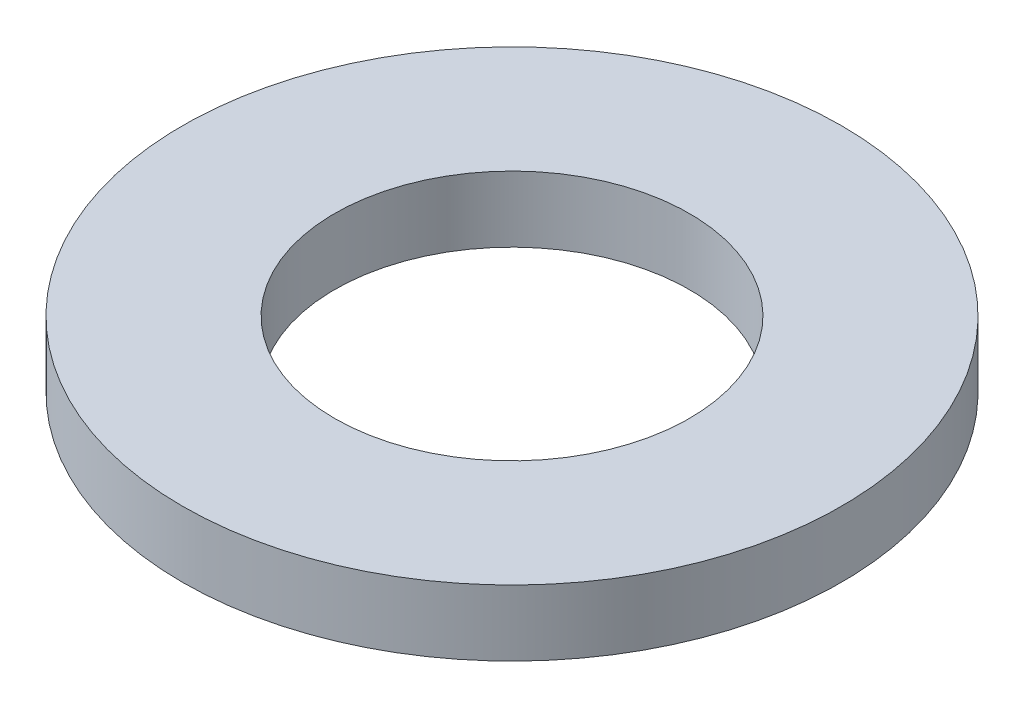
ISO-10303-21;
HEADER;
FILE_DESCRIPTION(('STEP AP214'),'2;1');
FILE_NAME('part.step','',(''),(''),'','','');
FILE_SCHEMA(('AUTOMOTIVE_DESIGN { 1 0 10303 214 1 1 1 1 }'));
ENDSEC;
DATA;
#1=APPLICATION_CONTEXT('core data for automotive mechanical design processes');
#2=APPLICATION_PROTOCOL_DEFINITION('international standard','automotive_design',2000,#1);
#3=PRODUCT_CONTEXT('',#1,'mechanical');
#4=PRODUCT('Part','Part','',(#3));
#5=PRODUCT_RELATED_PRODUCT_CATEGORY('part','',(#4));
#6=PRODUCT_DEFINITION_FORMATION('','',#4);
#7=PRODUCT_DEFINITION_CONTEXT('part definition',#1,'design');
#8=PRODUCT_DEFINITION('design','',#6,#7);
#9=PRODUCT_DEFINITION_SHAPE('','',#8);
#10=(LENGTH_UNIT() NAMED_UNIT(*) SI_UNIT(.MILLI.,.METRE.));
#11=(NAMED_UNIT(*) PLANE_ANGLE_UNIT() SI_UNIT($,.RADIAN.));
#12=(NAMED_UNIT(*) SI_UNIT($,.STERADIAN.) SOLID_ANGLE_UNIT());
#13=UNCERTAINTY_MEASURE_WITH_UNIT(LENGTH_MEASURE(1.E-05),#10,'distance_accuracy_value','');
#14=(GEOMETRIC_REPRESENTATION_CONTEXT(3) GLOBAL_UNCERTAINTY_ASSIGNED_CONTEXT((#13)) GLOBAL_UNIT_ASSIGNED_CONTEXT((#10,
#11,#12)) REPRESENTATION_CONTEXT('',''));
#15=CARTESIAN_POINT('',(0.,0.,0.));
#16=DIRECTION('',(0.,0.,1.));
#17=DIRECTION('',(1.,0.,0.));
#18=AXIS2_PLACEMENT_3D('',#15,#16,#17);
#19=CARTESIAN_POINT('',(0.,2.,0.));
#20=DIRECTION('',(0.,1.,0.));
#21=DIRECTION('',(0.,0.,1.));
#22=AXIS2_PLACEMENT_3D('',#19,#20,#21);
#23=PLANE('',#22);
#24=CARTESIAN_POINT('',(0.,2.,0.));
#25=DIRECTION('',(0.,1.,0.));
#26=DIRECTION('',(0.,0.,1.));
#27=AXIS2_PLACEMENT_3D('',#24,#25,#26);
#28=CIRCLE('',#27,10.);
#29=CARTESIAN_POINT('',(0.,2.,10.));
#30=VERTEX_POINT('',#29);
#31=EDGE_CURVE('E10',#30,#30,#28,.T.);
#32=ORIENTED_EDGE('',*,*,#31,.T.);
#33=EDGE_LOOP('',(#32));
#34=FACE_BOUND('',#33,.T.);
#35=CARTESIAN_POINT('',(0.,2.,0.));
#36=DIRECTION('',(0.,1.,0.));
#37=DIRECTION('',(0.,0.,1.));
#38=AXIS2_PLACEMENT_3D('',#35,#36,#37);
#39=CIRCLE('',#38,5.385);
#40=CARTESIAN_POINT('',(0.,2.,5.385));
#41=VERTEX_POINT('',#40);
#42=EDGE_CURVE('E54',#41,#41,#39,.T.);
#43=ORIENTED_EDGE('',*,*,#42,.F.);
#44=EDGE_LOOP('',(#43));
#45=FACE_BOUND('',#44,.T.);
#46=ADVANCED_FACE('F40',(#34,#45),#23,.T.);
#47=CARTESIAN_POINT('',(0.,0.,0.));
#48=DIRECTION('',(0.,1.,0.));
#49=DIRECTION('',(0.,0.,1.));
#50=AXIS2_PLACEMENT_3D('',#47,#48,#49);
#51=PLANE('',#50);
#52=CARTESIAN_POINT('',(0.,0.,0.));
#53=DIRECTION('',(0.,1.,0.));
#54=DIRECTION('',(0.,0.,1.));
#55=AXIS2_PLACEMENT_3D('',#52,#53,#54);
#56=CIRCLE('',#55,10.);
#57=CARTESIAN_POINT('',(0.,0.,10.));
#58=VERTEX_POINT('',#57);
#59=EDGE_CURVE('E44',#58,#58,#56,.T.);
#60=ORIENTED_EDGE('',*,*,#59,.F.);
#61=EDGE_LOOP('',(#60));
#62=FACE_BOUND('',#61,.T.);
#63=CARTESIAN_POINT('',(0.,0.,0.));
#64=DIRECTION('',(0.,1.,0.));
#65=DIRECTION('',(0.,0.,1.));
#66=AXIS2_PLACEMENT_3D('',#63,#64,#65);
#67=CIRCLE('',#66,5.385);
#68=CARTESIAN_POINT('',(0.,0.,5.385));
#69=VERTEX_POINT('',#68);
#70=EDGE_CURVE('E56',#69,#69,#67,.T.);
#71=ORIENTED_EDGE('',*,*,#70,.T.);
#72=EDGE_LOOP('',(#71));
#73=FACE_BOUND('',#72,.T.);
#74=ADVANCED_FACE('F69',(#62,#73),#51,.F.);
#75=CARTESIAN_POINT('',(0.,2.,0.));
#76=DIRECTION('',(0.,-1.,0.));
#77=DIRECTION('',(0.,0.,-1.));
#78=AXIS2_PLACEMENT_3D('',#75,#76,#77);
#79=CYLINDRICAL_SURFACE('',#78,10.);
#80=ORIENTED_EDGE('',*,*,#31,.F.);
#81=EDGE_LOOP('',(#80));
#82=FACE_BOUND('',#81,.T.);
#83=ORIENTED_EDGE('',*,*,#59,.T.);
#84=EDGE_LOOP('',(#83));
#85=FACE_BOUND('',#84,.T.);
#86=ADVANCED_FACE('F42',(#82,#85),#79,.T.);
#87=CARTESIAN_POINT('',(0.,2.,0.));
#88=DIRECTION('',(0.,-1.,0.));
#89=DIRECTION('',(0.,0.,-1.));
#90=AXIS2_PLACEMENT_3D('',#87,#88,#89);
#91=CYLINDRICAL_SURFACE('',#90,5.385);
#92=ORIENTED_EDGE('',*,*,#42,.T.);
#93=EDGE_LOOP('',(#92));
#94=FACE_BOUND('',#93,.T.);
#95=ORIENTED_EDGE('',*,*,#70,.F.);
#96=EDGE_LOOP('',(#95));
#97=FACE_BOUND('',#96,.T.);
#98=ADVANCED_FACE('F65',(#94,#97),#91,.F.);
#99=CLOSED_SHELL('',(#46,#74,#86,#98));
#100=MANIFOLD_SOLID_BREP('B2',#99);
#101=ADVANCED_BREP_SHAPE_REPRESENTATION('',(#18,#100),#14);
#102=SHAPE_DEFINITION_REPRESENTATION(#9,#101);
ENDSEC;
END-ISO-10303-21;
